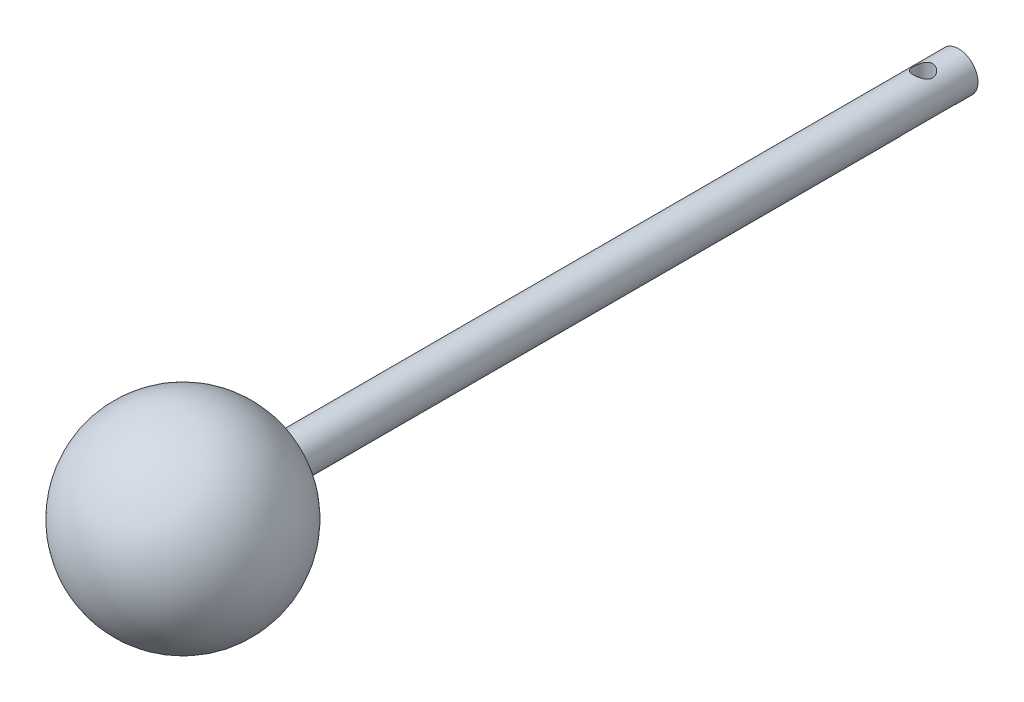
ISO-10303-21;
HEADER;
FILE_DESCRIPTION(('STEP AP214'),'2;1');
FILE_NAME('part.step','',(''),(''),'','','');
FILE_SCHEMA(('AUTOMOTIVE_DESIGN { 1 0 10303 214 1 1 1 1 }'));
ENDSEC;
DATA;
#1=APPLICATION_CONTEXT('core data for automotive mechanical design processes');
#2=APPLICATION_PROTOCOL_DEFINITION('international standard','automotive_design',2000,#1);
#3=PRODUCT_CONTEXT('',#1,'mechanical');
#4=PRODUCT('Part','Part','',(#3));
#5=PRODUCT_RELATED_PRODUCT_CATEGORY('part','',(#4));
#6=PRODUCT_DEFINITION_FORMATION('','',#4);
#7=PRODUCT_DEFINITION_CONTEXT('part definition',#1,'design');
#8=PRODUCT_DEFINITION('design','',#6,#7);
#9=PRODUCT_DEFINITION_SHAPE('','',#8);
#10=(LENGTH_UNIT() NAMED_UNIT(*) SI_UNIT(.MILLI.,.METRE.));
#11=(NAMED_UNIT(*) PLANE_ANGLE_UNIT() SI_UNIT($,.RADIAN.));
#12=(NAMED_UNIT(*) SI_UNIT($,.STERADIAN.) SOLID_ANGLE_UNIT());
#13=UNCERTAINTY_MEASURE_WITH_UNIT(LENGTH_MEASURE(1.E-05),#10,'distance_accuracy_value','');
#14=(GEOMETRIC_REPRESENTATION_CONTEXT(3) GLOBAL_UNCERTAINTY_ASSIGNED_CONTEXT((#13)) GLOBAL_UNIT_ASSIGNED_CONTEXT((#10,
#11,#12)) REPRESENTATION_CONTEXT('',''));
#15=CARTESIAN_POINT('',(0.,0.,0.));
#16=DIRECTION('',(0.,0.,1.));
#17=DIRECTION('',(1.,0.,0.));
#18=AXIS2_PLACEMENT_3D('',#15,#16,#17);
#19=CARTESIAN_POINT('',(0.,8.42264551000838,9.18353481621943));
#20=DIRECTION('',(0.,-1.,0.));
#21=DIRECTION('',(1.,0.,0.));
#22=AXIS2_PLACEMENT_3D('',#19,#20,#21);
#23=CYLINDRICAL_SURFACE('',#22,2.5);
#24=CARTESIAN_POINT('',(0.,-3.,9.18353481621943));
#25=DIRECTION('',(0.,1.,0.));
#26=DIRECTION('',(1.,0.,0.));
#27=AXIS2_PLACEMENT_3D('',#24,#25,#26);
#28=CIRCLE('',#27,2.5);
#29=CARTESIAN_POINT('',(2.5,-3.,9.18353481621943));
#30=VERTEX_POINT('',#29);
#31=EDGE_CURVE('E40',#30,#30,#28,.T.);
#32=ORIENTED_EDGE('',*,*,#31,.F.);
#33=EDGE_LOOP('',(#32));
#34=FACE_BOUND('',#33,.T.);
#35=CARTESIAN_POINT('',(2.49999999999999,4.3301270189222,9.18353481621945));
#36=CARTESIAN_POINT('',(2.50000357189181,4.33012436846133,9.2134385648796));
#37=CARTESIAN_POINT('',(2.49945420580769,4.33044211508466,9.24334183117544));
#38=CARTESIAN_POINT('',(2.49725839067198,4.33170907479288,9.3031838027478));
#39=CARTESIAN_POINT('',(2.49560868590302,4.33266016181208,9.33312234921477));
#40=CARTESIAN_POINT('',(2.49121069817965,4.33519034607211,9.3930345978749));
#41=CARTESIAN_POINT('',(2.48845724388733,4.33677239936563,9.4230077937966));
#42=CARTESIAN_POINT('',(2.48185027129498,4.34055686754822,9.48299031380353));
#43=CARTESIAN_POINT('',(2.4779897580484,4.34276322588981,9.51299861931255));
#44=CARTESIAN_POINT('',(2.47027696763565,4.34715380464842,9.56548838963977));
#45=CARTESIAN_POINT('',(2.46665390808778,4.34921128874467,9.58801455516167));
#46=CARTESIAN_POINT('',(2.45878399689496,4.35366533020504,9.63308717371318));
#47=CARTESIAN_POINT('',(2.45453296784057,4.35606415398197,9.65563267093891));
#48=CARTESIAN_POINT('',(2.44256078669089,4.36279379411801,9.71480480398581));
#49=CARTESIAN_POINT('',(2.43434738139976,4.36738580491933,9.75130355017033));
#50=CARTESIAN_POINT('',(2.41634324282664,4.37737265189183,9.82384315044416));
#51=CARTESIAN_POINT('',(2.40655071683352,4.38276839997567,9.85988343328606));
#52=CARTESIAN_POINT('',(2.38750031284656,4.39316918305496,9.92431797634327));
#53=CARTESIAN_POINT('',(2.37851907068697,4.39804078069178,9.95281601742791));
#54=CARTESIAN_POINT('',(2.35953101130036,4.40825704661183,10.0095215430486));
#55=CARTESIAN_POINT('',(2.34951999263467,4.41360363971139,10.0377272751838));
#56=CARTESIAN_POINT('',(2.32845922204102,4.42475087174056,10.0938462625237));
#57=CARTESIAN_POINT('',(2.3174038826815,4.43055392158107,10.1217569395754));
#58=CARTESIAN_POINT('',(2.29463041471399,4.44239033281668,10.1764072904831));
#59=CARTESIAN_POINT('',(2.28293576393672,4.44841431015372,10.2031587955206));
#60=CARTESIAN_POINT('',(2.25866751152916,4.4607854119482,10.256161842027));
#61=CARTESIAN_POINT('',(2.24609449643943,4.46713232000886,10.2824137025144));
#62=CARTESIAN_POINT('',(2.22005682930066,4.48012940275288,10.3344156930305));
#63=CARTESIAN_POINT('',(2.20659164698111,4.48677975704879,10.360165512683));
#64=CARTESIAN_POINT('',(2.17876180143769,4.50035967289574,10.4111646904905));
#65=CARTESIAN_POINT('',(2.16439551335376,4.50728973028826,10.4364130298194));
#66=CARTESIAN_POINT('',(2.1347539545745,4.52140418715307,10.4864098023569));
#67=CARTESIAN_POINT('',(2.11947600075465,4.52858930934856,10.5111564405466));
#68=CARTESIAN_POINT('',(2.08800175977412,4.54318730276697,10.5601506405346));
#69=CARTESIAN_POINT('',(2.07180178387543,4.55060102517722,10.5843955784495));
#70=CARTESIAN_POINT('',(2.03847389364994,4.5656281220451,10.6323872022057));
#71=CARTESIAN_POINT('',(2.02134134869948,4.57324237300109,10.6561303968736));
#72=CARTESIAN_POINT('',(1.98613864423402,4.58864084620464,10.7031193990812));
#73=CARTESIAN_POINT('',(1.96806298677012,4.59642586401521,10.7263608255402));
#74=CARTESIAN_POINT('',(1.93096439564478,4.6121345824022,10.7723472028923));
#75=CARTESIAN_POINT('',(1.91193517970728,4.62005889088795,10.7950868759854));
#76=CARTESIAN_POINT('',(1.87291975037994,4.63601334265663,10.8400705394552));
#77=CARTESIAN_POINT('',(1.852926558184,4.64404380193728,10.8623083623097));
#78=CARTESIAN_POINT('',(1.81197411084306,4.66017583924934,10.9062895692655));
#79=CARTESIAN_POINT('',(1.7910072778744,4.66827733837698,10.9280259224902));
#80=CARTESIAN_POINT('',(1.74866284531215,4.68430174657911,10.9704367821735));
#81=CARTESIAN_POINT('',(1.72729688996092,4.69222546065396,10.9911226114262));
#82=CARTESIAN_POINT('',(1.6839909011161,4.70794026302045,11.0316149636858));
#83=CARTESIAN_POINT('',(1.662055766514,4.71573188698127,11.0514265144381));
#84=CARTESIAN_POINT('',(1.61761006615234,4.73116136132125,11.0901711596232));
#85=CARTESIAN_POINT('',(1.59510359420044,4.73879984287848,11.1091086970126));
#86=CARTESIAN_POINT('',(1.54951378010458,4.75390164736191,11.146105835023));
#87=CARTESIAN_POINT('',(1.52643372473657,4.76136563496258,11.1641692127611));
#88=CARTESIAN_POINT('',(1.47969591264843,4.77609653334003,11.1994187433354));
#89=CARTESIAN_POINT('',(1.4560406427138,4.78336407741085,11.2166079276397));
#90=CARTESIAN_POINT('',(1.40815202014002,4.79767972765538,11.250109833688));
#91=CARTESIAN_POINT('',(1.38392037575836,4.80472836692863,11.2664247687466));
#92=CARTESIAN_POINT('',(1.33487913705574,4.81858339206425,11.2981790079978));
#93=CARTESIAN_POINT('',(1.31007050716133,4.82539013998691,11.313619643333));
#94=CARTESIAN_POINT('',(1.25987596593104,4.83873812517975,11.3436262058824));
#95=CARTESIAN_POINT('',(1.23449032279257,4.84527948202031,11.3581925284637));
#96=CARTESIAN_POINT('',(1.18314293650637,4.85807300172515,11.3864513188925));
#97=CARTESIAN_POINT('',(1.15718082481791,4.86432497121629,11.4001432046831));
#98=CARTESIAN_POINT('',(1.10468240089864,4.87651558545201,11.4266544601307));
#99=CARTESIAN_POINT('',(1.07814515357589,4.88245365595984,11.4394722423599));
#100=CARTESIAN_POINT('',(1.02449842284697,4.89399201700327,11.4642349785633));
#101=CARTESIAN_POINT('',(0.997387515280483,4.89959128882051,11.4761773209781));
#102=CARTESIAN_POINT('',(0.942031030932071,4.91053899476818,11.4994333717356));
#103=CARTESIAN_POINT('',(0.913773966657685,4.91587782038927,11.5107242744015));
#104=CARTESIAN_POINT('',(0.857034976824977,4.92608518197945,11.5322286087608));
#105=CARTESIAN_POINT('',(0.828556668433257,4.9309571441616,11.5424499506085));
#106=CARTESIAN_POINT('',(0.771382855792471,4.94022280350879,11.5618147223377));
#107=CARTESIAN_POINT('',(0.742690204027521,4.94461956738769,11.5709651000724));
#108=CARTESIAN_POINT('',(0.685096241422916,4.9529268909176,11.5881893065414));
#109=CARTESIAN_POINT('',(0.656197067647812,4.95684009166168,11.5962690023563));
#110=CARTESIAN_POINT('',(0.598198627219454,4.96417253096754,11.6113528662115));
#111=CARTESIAN_POINT('',(0.569100854438773,4.96759392132686,11.6183617284601));
#112=CARTESIAN_POINT('',(0.510714014108328,4.97393512902604,11.6313051443186));
#113=CARTESIAN_POINT('',(0.481425883889614,4.97685655075075,11.6372431377448));
#114=CARTESIAN_POINT('',(0.422667286881024,4.98219036861321,11.6480461243669));
#115=CARTESIAN_POINT('',(0.393197301642624,4.98460377066108,11.6529132388508));
#116=CARTESIAN_POINT('',(0.334084112865155,4.98891425181047,11.6615756764101));
#117=CARTESIAN_POINT('',(0.304441047039379,4.99081169598054,11.6653717573726));
#118=CARTESIAN_POINT('',(0.244990971840921,4.9940831185346,11.6718939928751));
#119=CARTESIAN_POINT('',(0.215183876389995,4.99545678875643,11.6746195175821));
#120=CARTESIAN_POINT('',(0.155415128343623,4.99767367075587,11.679000208854));
#121=CARTESIAN_POINT('',(0.125453290470905,4.99851587965877,11.6806533519838));
#122=CARTESIAN_POINT('',(0.0653846981960944,4.99966299807511,11.6828975027709));
#123=CARTESIAN_POINT('',(0.0352777851564572,4.99996619995026,11.6834851348798));
#124=CARTESIAN_POINT('',(-0.0248862169766115,5.00002840095424,11.6835737304757));
#125=CARTESIAN_POINT('',(-0.054943301803073,4.99978834418574,11.6830765792086));
#126=CARTESIAN_POINT('',(-0.115065322202673,4.99876640491978,11.6809765250161));
#127=CARTESIAN_POINT('',(-0.145130169533901,4.99798352141381,11.6793715792691));
#128=CARTESIAN_POINT('',(-0.205257893763868,4.99587600403502,11.6750642827602));
#129=CARTESIAN_POINT('',(-0.235320460898459,4.99454965678501,11.672358461462));
#130=CARTESIAN_POINT('',(-0.295434640940632,4.99135536176211,11.6658488750451));
#131=CARTESIAN_POINT('',(-0.325485600816148,4.9894850131257,11.662040243188));
#132=CARTESIAN_POINT('',(-0.378015766857459,4.98574132129471,11.6544221833287));
#133=CARTESIAN_POINT('',(-0.400537094940378,4.98398215220402,11.6508439448819));
#134=CARTESIAN_POINT('',(-0.445564531260932,4.98015915801641,11.6430705470995));
#135=CARTESIAN_POINT('',(-0.46806999877624,4.97809385172167,11.6388723887753));
#136=CARTESIAN_POINT('',(-0.505321729887863,4.97442175696046,11.6314100873184));
#137=CARTESIAN_POINT('',(-0.520109857551539,4.97289714859784,11.6283123190343));
#138=CARTESIAN_POINT('',(-0.564327611330325,4.96813972036703,11.618641168258));
#139=CARTESIAN_POINT('',(-0.593654090325438,4.96471939473746,11.6116820243195));
#140=CARTESIAN_POINT('',(-0.651957357598609,4.95739994143524,11.5967453132958));
#141=CARTESIAN_POINT('',(-0.680934429945751,4.95350123621516,11.5887686445343));
#142=CARTESIAN_POINT('',(-0.738533375828231,4.94524167126844,11.5717975987022));
#143=CARTESIAN_POINT('',(-0.767155126194414,4.94088065602236,11.5628028790937));
#144=CARTESIAN_POINT('',(-0.824037642168308,4.93171300399732,11.5437982792166));
#145=CARTESIAN_POINT('',(-0.852297779135632,4.9269056866458,11.53378684629));
#146=CARTESIAN_POINT('',(-0.908449952238239,4.91686226232377,11.5127453319664));
#147=CARTESIAN_POINT('',(-0.936340760122503,4.91162501080349,11.5017125208456));
#148=CARTESIAN_POINT('',(-0.991422632559728,4.90080222994119,11.4787858647256));
#149=CARTESIAN_POINT('',(-1.0186175425954,4.89521987837902,11.4668997494426));
#150=CARTESIAN_POINT('',(-1.0724385782207,4.88371075360811,11.4422425874943));
#151=CARTESIAN_POINT('',(-1.09906602087871,4.87778493299342,11.4294739710773));
#152=CARTESIAN_POINT('',(-1.1517486315468,4.86561454573107,11.4030482451876));
#153=CARTESIAN_POINT('',(-1.17780461783901,4.85937048409452,11.3893925345202));
#154=CARTESIAN_POINT('',(-1.22934407503335,4.84658826146615,11.3611948992809));
#155=CARTESIAN_POINT('',(-1.25482778021704,4.84005022423945,11.3466533467545));
#156=CARTESIAN_POINT('',(-1.30522248712119,4.8267042791642,11.3166847241174));
#157=CARTESIAN_POINT('',(-1.33013306932871,4.81989618298314,11.3012570325524));
#158=CARTESIAN_POINT('',(-1.37938219128708,4.80603374896337,11.2695172085934));
#159=CARTESIAN_POINT('',(-1.40371959827919,4.79897898246865,11.2532035062205));
#160=CARTESIAN_POINT('',(-1.45182360825639,4.78464627111744,11.2196925767869));
#161=CARTESIAN_POINT('',(-1.47558831814384,4.77736772993233,11.2024928881315));
#162=CARTESIAN_POINT('',(-1.52254876412806,4.76260994540286,11.1672108683558));
#163=CARTESIAN_POINT('',(-1.54574181316511,4.75513000992087,11.1491252515708));
#164=CARTESIAN_POINT('',(-1.59156129209266,4.73999132901436,11.1120721878689));
#165=CARTESIAN_POINT('',(-1.61418422114388,4.73233186521383,11.0931007072301));
#166=CARTESIAN_POINT('',(-1.65886631166173,4.7168554136314,11.0542766156075));
#167=CARTESIAN_POINT('',(-1.68092115265911,4.70903774695441,11.0344193050344));
#168=CARTESIAN_POINT('',(-1.72447031191378,4.69326564112242,10.9938243015744));
#169=CARTESIAN_POINT('',(-1.74595949726196,4.6853106237693,10.973081330694));
#170=CARTESIAN_POINT('',(-1.78842621393352,4.66926674205247,10.9306701589135));
#171=CARTESIAN_POINT('',(-1.80939625423543,4.66117734118994,10.908994659568));
#172=CARTESIAN_POINT('',(-1.85035948560423,4.64506722731085,10.8651326415768));
#173=CARTESIAN_POINT('',(-1.87036015154586,4.63704660492418,10.8429530744696));
#174=CARTESIAN_POINT('',(-1.9093951943011,4.62110923515827,10.7980838503633));
#175=CARTESIAN_POINT('',(-1.92843644354412,4.61319218997795,10.7754002803578));
#176=CARTESIAN_POINT('',(-1.96556357757294,4.59749529028218,10.7295239150944));
#177=CARTESIAN_POINT('',(-1.98365564034865,4.58971484997981,10.706336322038));
#178=CARTESIAN_POINT('',(-2.01889557439279,4.57432267662596,10.6594528196424));
#179=CARTESIAN_POINT('',(-2.0360488414329,4.56671017352353,10.6357612202542));
#180=CARTESIAN_POINT('',(-2.06942250695841,4.55168360044342,10.5878706065284));
#181=CARTESIAN_POINT('',(-2.08564743741214,4.54426868173667,10.5636750176363));
#182=CARTESIAN_POINT('',(-2.11717584591211,4.52966522007198,10.5147773323855));
#183=CARTESIAN_POINT('',(-2.13248291871317,4.52247585486568,10.490077799995));
#184=CARTESIAN_POINT('',(-2.16218689889235,4.50834975301974,10.4401730464351));
#185=CARTESIAN_POINT('',(-2.17658640131949,4.50141232260569,10.4149695664791));
#186=CARTESIAN_POINT('',(-2.20448681010782,4.4878144248331,10.364057918314));
#187=CARTESIAN_POINT('',(-2.21798926032284,4.48115348944551,10.3383507212779));
#188=CARTESIAN_POINT('',(-2.2441054828023,4.4681319850139,10.2864317442777));
#189=CARTESIAN_POINT('',(-2.25671971245245,4.46177126194144,10.2602202329946));
#190=CARTESIAN_POINT('',(-2.28107457695479,4.44936912451037,10.207295782471));
#191=CARTESIAN_POINT('',(-2.29281456191901,4.44332794864139,10.180582488332));
#192=CARTESIAN_POINT('',(-2.31565961584536,4.43146589910227,10.126062986068));
#193=CARTESIAN_POINT('',(-2.32674313487943,4.42565360082379,10.0982458672655));
#194=CARTESIAN_POINT('',(-2.34786513228278,4.41448426867569,10.0423149783967));
#195=CARTESIAN_POINT('',(-2.35790921233472,4.40912482650033,10.0142038063986));
#196=CARTESIAN_POINT('',(-2.37696849125148,4.39887909802672,9.95768792679288));
#197=CARTESIAN_POINT('',(-2.38598792215553,4.39399087917006,9.92928499751093));
#198=CARTESIAN_POINT('',(-2.40300762345494,4.38470615767644,9.87218612467783));
#199=CARTESIAN_POINT('',(-2.41101071702147,4.38030829727169,9.84349124307917));
#200=CARTESIAN_POINT('',(-2.42600820429211,4.37201984756252,9.7858080966517));
#201=CARTESIAN_POINT('',(-2.43300395769211,4.36812857516541,9.75682028490194));
#202=CARTESIAN_POINT('',(-2.44274698536783,4.36268276862039,9.71312587997515));
#203=CARTESIAN_POINT('',(-2.44586950270997,4.36093271634866,9.69852594170867));
#204=CARTESIAN_POINT('',(-2.45345387843561,4.35667210219709,9.66149592705286));
#205=CARTESIAN_POINT('',(-2.45774752412372,4.35425058666724,9.63902068026902));
#206=CARTESIAN_POINT('',(-2.46570499822654,4.34974937090871,9.59408483262976));
#207=CARTESIAN_POINT('',(-2.46937291666076,4.34766745517157,9.57162517439396));
#208=CARTESIAN_POINT('',(-2.47719352400692,4.34321754458178,9.51928387531861));
#209=CARTESIAN_POINT('',(-2.48111779571376,4.34097565816996,9.48935689407158));
#210=CARTESIAN_POINT('',(-2.48785696062326,4.33711686678043,9.42952899668036));
#211=CARTESIAN_POINT('',(-2.49067864925463,4.33549613473843,9.39962909161609));
#212=CARTESIAN_POINT('',(-2.49521792526165,4.3328852221355,9.33985537925674));
#213=CARTESIAN_POINT('',(-2.49694049494245,4.33189219637665,9.30998207611879));
#214=CARTESIAN_POINT('',(-2.49928675032716,4.3305389469932,9.25026221307012));
#215=CARTESIAN_POINT('',(-2.49991351768171,4.33017694878109,9.22041581485234));
#216=CARTESIAN_POINT('',(-2.50006672218875,4.3300884975495,9.16071007942312));
#217=CARTESIAN_POINT('',(-2.49959282373387,4.33036223837514,9.13085074104152));
#218=CARTESIAN_POINT('',(-2.49754564368272,4.33154327585312,9.0710683966838));
#219=CARTESIAN_POINT('',(-2.49596817491021,4.33245298549465,9.04114558238437));
#220=CARTESIAN_POINT('',(-2.49171491230013,4.33490055647972,8.98123614506266));
#221=CARTESIAN_POINT('',(-2.48903303761676,4.33644189533302,8.95125009800356));
#222=CARTESIAN_POINT('',(-2.4825689366641,4.34014578704983,8.89121328104734));
#223=CARTESIAN_POINT('',(-2.47877882939259,4.34231278775903,8.86116363359196));
#224=CARTESIAN_POINT('',(-2.47118964508965,4.34663499783012,8.80858183324445));
#225=CARTESIAN_POINT('',(-2.46761879016612,4.34866385273424,8.7860059311507));
#226=CARTESIAN_POINT('',(-2.45985349054963,4.35306108680075,8.74081763506724));
#227=CARTESIAN_POINT('',(-2.45565452969892,4.35543192001268,8.71820625865663));
#228=CARTESIAN_POINT('',(-2.44381069383092,4.36209361889763,8.658810316123));
#229=CARTESIAN_POINT('',(-2.43567195497703,4.36664705199428,8.62215222809874));
#230=CARTESIAN_POINT('',(-2.41781410083878,4.37656020312242,8.549315180928));
#231=CARTESIAN_POINT('',(-2.40809423699485,4.38192030296758,8.51313645754626));
#232=CARTESIAN_POINT('',(-2.38917146372008,4.3922604274155,8.44846757410989));
#233=CARTESIAN_POINT('',(-2.3802474298191,4.39710547806521,8.4198737777915));
#234=CARTESIAN_POINT('',(-2.36137251185484,4.40727072532101,8.36299024705121));
#235=CARTESIAN_POINT('',(-2.35141791221731,4.41259263119342,8.33470204976886));
#236=CARTESIAN_POINT('',(-2.33046871539623,4.42369265214561,8.2784316708885));
#237=CARTESIAN_POINT('',(-2.31946898698191,4.42947299236244,8.25045184062628));
#238=CARTESIAN_POINT('',(-2.29679060386848,4.44127373413371,8.19564607905497));
#239=CARTESIAN_POINT('',(-2.28513493894109,4.4472848904099,8.1688086292402));
#240=CARTESIAN_POINT('',(-2.26093578319198,4.45963606968429,8.1156312756582));
#241=CARTESIAN_POINT('',(-2.2483927508084,4.46597592242316,8.08929112375648));
#242=CARTESIAN_POINT('',(-2.22240599471538,4.47896446737574,8.03711014734927));
#243=CARTESIAN_POINT('',(-2.20896159113653,4.48561339152411,8.01126971913077));
#244=CARTESIAN_POINT('',(-2.18116416300349,4.49919578084129,7.96008689873543));
#245=CARTESIAN_POINT('',(-2.16680934544627,4.50612979740651,7.93474562681556));
#246=CARTESIAN_POINT('',(-2.13718145763323,4.52025725222446,7.88456055002875));
#247=CARTESIAN_POINT('',(-2.12190551975674,4.5274514694254,7.8597186576951));
#248=CARTESIAN_POINT('',(-2.09042590473813,4.54207244179535,7.81053149415226));
#249=CARTESIAN_POINT('',(-2.07421834077472,4.54950010222879,7.78618898025588));
#250=CARTESIAN_POINT('',(-2.04086571955712,4.56455954137177,7.7379997327869));
#251=CARTESIAN_POINT('',(-2.02371582278045,4.57219224578005,7.71415663909284));
#252=CARTESIAN_POINT('',(-1.9884686969377,4.58763173707879,7.66696535597319));
#253=CARTESIAN_POINT('',(-1.97036575299414,4.59543936124109,7.64362171052014));
#254=CARTESIAN_POINT('',(-1.93320271593591,4.61119700792288,7.59742838439775));
#255=CARTESIAN_POINT('',(-1.91413611844193,4.6191476700919,7.57458415694765));
#256=CARTESIAN_POINT('',(-1.87503583136846,4.63515813699232,7.52938891601023));
#257=CARTESIAN_POINT('',(-1.85499493772917,4.64321827752721,7.50704425678044));
#258=CARTESIAN_POINT('',(-1.81393699677841,4.65941245295328,7.46284669355457));
#259=CARTESIAN_POINT('',(-1.79291214792821,4.66754641401748,7.44100101383588));
#260=CARTESIAN_POINT('',(-1.75048893209346,4.68361976679944,7.39841919746458));
#261=CARTESIAN_POINT('',(-1.72910373978136,4.69156005606397,7.37767027300535));
#262=CARTESIAN_POINT('',(-1.68575768559864,4.70730803920402,7.33705580934387));
#263=CARTESIAN_POINT('',(-1.66380179666083,4.7151162694889,7.31718517454015));
#264=CARTESIAN_POINT('',(-1.61931316607485,4.73057884313765,7.27832623760695));
#265=CARTESIAN_POINT('',(-1.59678458499078,4.73823382210092,7.25933342695662));
#266=CARTESIAN_POINT('',(-1.55114907347632,4.75336845021878,7.22222967117241));
#267=CARTESIAN_POINT('',(-1.52804549015915,4.76084877120249,7.20411488508604));
#268=CARTESIAN_POINT('',(-1.48125914889766,4.77561208166241,7.16876645001231));
#269=CARTESIAN_POINT('',(-1.45757893081192,4.78289571398313,7.15152970898483));
#270=CARTESIAN_POINT('',(-1.40963893109848,4.79724320657007,7.11793660167055));
#271=CARTESIAN_POINT('',(-1.38538090327769,4.80430761128797,7.10157796584806));
#272=CARTESIAN_POINT('',(-1.33628541569932,4.81819375010001,7.06974023247559));
#273=CARTESIAN_POINT('',(-1.31144895823793,4.82501585876526,7.0542597530634));
#274=CARTESIAN_POINT('',(-1.26119728213811,4.83839406331016,7.02417740068081));
#275=CARTESIAN_POINT('',(-1.23578236194533,4.84495029171665,7.00957508819453));
#276=CARTESIAN_POINT('',(-1.18437493979856,4.85777296699044,6.9812482224545));
#277=CARTESIAN_POINT('',(-1.15838209219058,4.86403923313305,6.96752421463379));
#278=CARTESIAN_POINT('',(-1.10582074218491,4.87625776064504,6.94095256286125));
#279=CARTESIAN_POINT('',(-1.07925132070103,4.88220945934245,6.92810647799086));
#280=CARTESIAN_POINT('',(-1.02553871682296,4.89377432254222,6.90329115893486));
#281=CARTESIAN_POINT('',(-0.998394119800228,4.89938647809135,6.89132451737201));
#282=CARTESIAN_POINT('',(-0.943004488143033,4.91035214605416,6.86803792729273));
#283=CARTESIAN_POINT('',(-0.914748557535929,4.91569656114496,6.85673959921702));
#284=CARTESIAN_POINT('',(-0.858008869673327,4.92591566233082,6.83521921431823));
#285=CARTESIAN_POINT('',(-0.829528688824369,4.93079373323077,6.82498934262626));
#286=CARTESIAN_POINT('',(-0.772348064977339,4.94007202945738,6.80560649784171));
#287=CARTESIAN_POINT('',(-0.743650436941315,4.94447527874523,6.79644667447302));
#288=CARTESIAN_POINT('',(-0.686043451488618,4.95279583063504,6.77920250963247));
#289=CARTESIAN_POINT('',(-0.657136196833357,4.9567157304441,6.77111240153763));
#290=CARTESIAN_POINT('',(-0.599118500665963,4.96406166610843,6.75600665711298));
#291=CARTESIAN_POINT('',(-0.570009522575816,4.9674898088546,6.74898642837448));
#292=CARTESIAN_POINT('',(-0.511597165527898,4.97384445677921,6.73601921942044));
#293=CARTESIAN_POINT('',(-0.482294697632271,4.97677252060861,6.73006890131693));
#294=CARTESIAN_POINT('',(-0.423504310748636,4.98211939363687,6.71924020500136));
#295=CARTESIAN_POINT('',(-0.394016851424478,4.98453916240707,6.71435980619592));
#296=CARTESIAN_POINT('',(-0.334865597471637,4.98886198143733,6.7056697468737));
#297=CARTESIAN_POINT('',(-0.305201923064375,4.99076535006719,6.70185942658349));
#298=CARTESIAN_POINT('',(-0.245707517869068,4.99404805771825,6.69530764100304));
#299=CARTESIAN_POINT('',(-0.215876687740768,4.9954270417678,6.69256689971009));
#300=CARTESIAN_POINT('',(-0.156057365177914,4.99765381769267,6.68815478862535));
#301=CARTESIAN_POINT('',(-0.126068678087209,4.99850056000898,6.68648553162051));
#302=CARTESIAN_POINT('',(-0.0659433072374997,4.999655840401,6.6842078701169));
#303=CARTESIAN_POINT('',(-0.035806458891169,4.99996262448644,6.68360292290483));
#304=CARTESIAN_POINT('',(0.0243836053600901,5.00003085181549,6.6834797378089));
#305=CARTESIAN_POINT('',(0.0544368121873432,4.99979386292711,6.68395837555666));
#306=CARTESIAN_POINT('',(0.114540876981693,4.99877836227408,6.68602078566939));
#307=CARTESIAN_POINT('',(0.144591665251603,4.99799904725414,6.68760619732097));
#308=CARTESIAN_POINT('',(0.204681103079329,4.9958995183993,6.69187352154715));
#309=CARTESIAN_POINT('',(0.234719480608869,4.99457778891296,6.69455850658038));
#310=CARTESIAN_POINT('',(0.294775034196645,4.99139415045148,6.70102555564071));
#311=CARTESIAN_POINT('',(0.324791612441665,4.98953003723083,6.70481209637575));
#312=CARTESIAN_POINT('',(0.377255401821749,4.98579875931581,6.71239118518272));
#313=CARTESIAN_POINT('',(0.399744556045231,4.98404561848665,6.71595216566137));
#314=CARTESIAN_POINT('',(0.444701187676301,4.98023616184639,6.72369025187559));
#315=CARTESIAN_POINT('',(0.467168055441746,4.97817844640369,6.727870202044));
#316=CARTESIAN_POINT('',(0.526558743678327,4.97233520728819,6.73974088616114));
#317=CARTESIAN_POINT('',(0.563356976820832,4.96829794497945,6.74794363757572));
#318=CARTESIAN_POINT('',(0.636419195439916,4.95946802417064,6.76594874572634));
#319=CARTESIAN_POINT('',(0.672683779513571,4.95467629599351,6.77574913295584));
#320=CARTESIAN_POINT('',(0.737459501146081,4.94540190708359,6.79482428718166));
#321=CARTESIAN_POINT('',(0.766073636718462,4.94104841272942,6.80381361818142));
#322=CARTESIAN_POINT('',(0.822947081914783,4.9318950773332,6.82281143531107));
#323=CARTESIAN_POINT('',(0.851205675276045,4.92709446124271,6.83282169409871));
#324=CARTESIAN_POINT('',(0.907360083508226,4.91706352611358,6.85386534171293));
#325=CARTESIAN_POINT('',(0.935254569037395,4.91183197122016,6.86490168569903));
#326=CARTESIAN_POINT('',(0.990399829600447,4.90100936894227,6.88785830177563));
#327=CARTESIAN_POINT('',(1.01765349581986,4.89542071262674,6.89977276282428));
#328=CARTESIAN_POINT('',(1.07159191496202,4.88389693325529,6.92448804037172));
#329=CARTESIAN_POINT('',(1.09827797007997,4.87796275517868,6.93728645567763));
#330=CARTESIAN_POINT('',(1.15107739825019,4.86577371644594,6.9637738206039));
#331=CARTESIAN_POINT('',(1.17719157337726,4.85951935229336,6.97746139978707));
#332=CARTESIAN_POINT('',(1.22884703096305,4.84671463594998,7.00572464795598));
#333=CARTESIAN_POINT('',(1.25438852968333,4.84016439840692,7.02029997369949));
#334=CARTESIAN_POINT('',(1.30489839862393,4.82679222811232,7.0503380623883));
#335=CARTESIAN_POINT('',(1.32986632970395,4.81997009744782,7.06580147552767));
#336=CARTESIAN_POINT('',(1.37922970068666,4.80607782994478,7.09761465150554));
#337=CARTESIAN_POINT('',(1.40362398678991,4.79900725455129,7.11396601267881));
#338=CARTESIAN_POINT('',(1.45184128332601,4.78464122068282,7.14755416901289));
#339=CARTESIAN_POINT('',(1.47566237842891,4.77734515579026,7.16479345348819));
#340=CARTESIAN_POINT('',(1.52273509169381,4.76255068333396,7.20015658618255));
#341=CARTESIAN_POINT('',(1.54598399957319,4.75505157348422,7.21828374697837));
#342=CARTESIAN_POINT('',(1.59191471308332,4.73987294884107,7.25542177575577));
#343=CARTESIAN_POINT('',(1.61459299414522,4.73219270547497,7.27443670313078));
#344=CARTESIAN_POINT('',(1.6593851439285,4.71667321445332,7.31334973703729));
#345=CARTESIAN_POINT('',(1.68149466714114,4.70883327813894,7.33325256871276));
#346=CARTESIAN_POINT('',(1.72515308207843,4.69301500510932,7.3739400213179));
#347=CARTESIAN_POINT('',(1.74669681948543,4.68503607916602,7.39472994010992));
#348=CARTESIAN_POINT('',(1.78927565132777,4.66894161682482,7.43724402647236));
#349=CARTESIAN_POINT('',(1.81030303296368,4.66082552559241,7.45897570993553));
#350=CARTESIAN_POINT('',(1.85137118421677,4.64466435793864,7.50295242281513));
#351=CARTESIAN_POINT('',(1.87141960194398,4.63661936485488,7.52519033632161));
#352=CARTESIAN_POINT('',(1.91054111585729,4.62063579875266,7.57017791785721));
#353=CARTESIAN_POINT('',(1.92962124534626,4.61269691241291,7.59292135595556));
#354=CARTESIAN_POINT('',(1.96681711301094,4.59695933219472,7.63891927686063));
#355=CARTESIAN_POINT('',(1.98493918181067,4.58916002858775,7.66216842969528));
#356=CARTESIAN_POINT('',(2.02023029908177,4.57373347977698,7.70917680870834));
#357=CARTESIAN_POINT('',(2.03740488344006,4.56610543531782,7.73293161510288));
#358=CARTESIAN_POINT('',(2.0708125017162,4.55105146397255,7.78095039321642));
#359=CARTESIAN_POINT('',(2.08705019292226,4.54362465645643,7.80521084769156));
#360=CARTESIAN_POINT('',(2.11859559505692,4.52900139731288,7.85423999423488));
#361=CARTESIAN_POINT('',(2.13390700869464,4.52180409162822,7.87900604865024));
#362=CARTESIAN_POINT('',(2.16361130050652,4.50766634602744,7.92904555307272));
#363=CARTESIAN_POINT('',(2.17800686203489,4.50072518336628,7.95431720574892));
#364=CARTESIAN_POINT('',(2.20589112565542,4.48712430548934,8.00536690935667));
#365=CARTESIAN_POINT('',(2.21938143839656,4.48046409867818,8.03114394943409));
#366=CARTESIAN_POINT('',(2.24546539004661,4.46744866344388,8.08320422723539));
#367=CARTESIAN_POINT('',(2.2580595299884,4.46109326526649,8.10948717150709));
#368=CARTESIAN_POINT('',(2.28236584497707,4.44870681186252,8.16255638213424));
#369=CARTESIAN_POINT('',(2.29407738928394,4.44267598945496,8.18934299166488));
#370=CARTESIAN_POINT('',(2.31687365085219,4.43083124288873,8.24404789974908));
#371=CARTESIAN_POINT('',(2.32793542755631,4.42502648914233,8.27197775739015));
#372=CARTESIAN_POINT('',(2.34901324736583,4.41387339119965,8.32814715437525));
#373=CARTESIAN_POINT('',(2.35903445549263,4.40852281943632,8.35638431115252));
#374=CARTESIAN_POINT('',(2.37804672429512,4.39829623730661,8.41316491085697));
#375=CARTESIAN_POINT('',(2.38704155755468,4.39341849962761,8.44170678066146));
#376=CARTESIAN_POINT('',(2.40612804649964,4.38300052682814,8.50625709355439));
#377=CARTESIAN_POINT('',(2.41594239805154,4.3775939554373,8.54236955222144));
#378=CARTESIAN_POINT('',(2.43399601667908,4.36758170736321,8.61507262764545));
#379=CARTESIAN_POINT('',(2.44223623596866,4.36297554665407,8.6516629409371));
#380=CARTESIAN_POINT('',(2.45425899254668,4.35621855000214,8.7110036311969));
#381=CARTESIAN_POINT('',(2.4585320535655,4.35380763497924,8.73362642755314));
#382=CARTESIAN_POINT('',(2.46644309175201,4.34933086895668,8.77883661019778));
#383=CARTESIAN_POINT('',(2.47008568832374,4.34726251331491,8.80142293737657));
#384=CARTESIAN_POINT('',(2.47783928903757,4.34284910913974,8.85402650118179));
#385=CARTESIAN_POINT('',(2.48172180382559,4.34063034142149,8.8840884373641));
#386=CARTESIAN_POINT('',(2.4883669176082,4.33682424523065,8.94414805036723));
#387=CARTESIAN_POINT('',(2.49113764137643,4.33523233743489,8.97414453853078));
#388=CARTESIAN_POINT('',(2.4955642775039,4.33268574985482,9.03407318804825));
#389=CARTESIAN_POINT('',(2.49722651437861,4.3317274552374,9.06400472597784));
#390=CARTESIAN_POINT('',(2.49944150702773,4.33044944752996,9.12380232979519));
#391=CARTESIAN_POINT('',(2.49999867479784,4.33012719506258,9.15366817856063));
#392=CARTESIAN_POINT('',(2.49999999999999,4.3301270189222,9.18353481621945));
#393=B_SPLINE_CURVE_WITH_KNOTS('',3,(#35,#36,#37,#38,#39,#40,#41,#42,#43,#44,#45,#46,#47,#48,
#49,#50,#51,#52,#53,#54,#55,#56,#57,#58,#59,#60,#61,#62,#63,#64,#65,#66,#67,#68,#69,#70,#71,#72,
#73,#74,#75,#76,#77,#78,#79,#80,#81,#82,#83,#84,#85,#86,#87,#88,#89,#90,#91,#92,#93,#94,#95,#96,
#97,#98,#99,#100,#101,#102,#103,#104,#105,#106,#107,#108,#109,#110,#111,#112,#113,#114,#115,
#116,#117,#118,#119,#120,#121,#122,#123,#124,#125,#126,#127,#128,#129,#130,#131,#132,#133,#134,
#135,#136,#137,#138,#139,#140,#141,#142,#143,#144,#145,#146,#147,#148,#149,#150,#151,#152,#153,
#154,#155,#156,#157,#158,#159,#160,#161,#162,#163,#164,#165,#166,#167,#168,#169,#170,#171,#172,
#173,#174,#175,#176,#177,#178,#179,#180,#181,#182,#183,#184,#185,#186,#187,#188,#189,#190,#191,
#192,#193,#194,#195,#196,#197,#198,#199,#200,#201,#202,#203,#204,#205,#206,#207,#208,#209,#210,
#211,#212,#213,#214,#215,#216,#217,#218,#219,#220,#221,#222,#223,#224,#225,#226,#227,#228,#229,
#230,#231,#232,#233,#234,#235,#236,#237,#238,#239,#240,#241,#242,#243,#244,#245,#246,#247,#248,
#249,#250,#251,#252,#253,#254,#255,#256,#257,#258,#259,#260,#261,#262,#263,#264,#265,#266,#267,
#268,#269,#270,#271,#272,#273,#274,#275,#276,#277,#278,#279,#280,#281,#282,#283,#284,#285,#286,
#287,#288,#289,#290,#291,#292,#293,#294,#295,#296,#297,#298,#299,#300,#301,#302,#303,#304,#305,
#306,#307,#308,#309,#310,#311,#312,#313,#314,#315,#316,#317,#318,#319,#320,#321,#322,#323,#324,
#325,#326,#327,#328,#329,#330,#331,#332,#333,#334,#335,#336,#337,#338,#339,#340,#341,#342,#343,
#344,#345,#346,#347,#348,#349,#350,#351,#352,#353,#354,#355,#356,#357,#358,#359,#360,#361,#362,
#363,#364,#365,#366,#367,#368,#369,#370,#371,#372,#373,#374,#375,#376,#377,#378,#379,#380,#381,
#382,#383,#384,#385,#386,#387,#388,#389,#390,#391,#392),.UNSPECIFIED.,.F.,.F.,(4,2,2,2,2,2,2,2,
2,2,2,2,2,2,2,2,2,2,2,2,2,2,2,2,2,2,2,2,2,2,2,2,2,2,2,2,2,2,2,2,2,2,2,2,2,2,2,2,2,2,2,2,2,2,2,2,
2,2,2,2,2,2,2,2,2,2,2,2,2,2,2,2,2,2,2,2,2,2,2,2,2,2,2,2,2,2,2,2,2,2,2,2,2,2,2,2,2,2,2,2,2,2,2,2,
2,2,2,2,2,2,2,2,2,2,2,2,2,2,2,2,2,2,2,2,2,2,2,2,2,2,2,2,2,2,2,2,2,2,2,2,2,2,2,2,2,2,2,2,2,2,2,2,
2,2,2,2,2,2,2,2,2,2,2,2,2,2,2,2,2,2,2,2,2,2,2,2,2,2,4),(0.,0.0897036407882287,0.179673884013625,
0.270070681087394,0.361051733524215,0.429766200339865,0.498960277053857,0.611990144995458,
0.72514924637176,0.815950631651252,0.907138398099782,0.998845137028114,1.08825931971475,
1.17761435519927,1.2670229848078,1.35659774707546,1.4464505558559,1.53669229006829,
1.62743240241173,1.71877855357962,1.81083627747151,1.90370868170098,1.99749618641382,
2.08980885190265,2.18149302291117,2.27264339310788,2.36335632775487,2.45372959134064,
2.5438620535563,2.63385337766638,2.72380369596446,2.81381327748721,2.90398219345595,
2.99440998600192,3.08707078928316,3.1789889622628,3.27027320411669,3.36103449170691,
3.45138572892057,3.54144136191144,3.63131696609084,3.7211288118866,3.81099341720377,
3.90102709510733,3.99134550546124,4.08150707641728,4.17183535502635,4.26245062983052,
4.35347205154721,4.42207742855105,4.49102628582235,4.53658168281604,4.6275594590582,
4.71845746420971,4.80938614474218,4.90045583554512,4.99177636042086,5.08235442518871,
5.1726922947089,5.26289102017278,5.35305212073499,5.44327724266246,5.53366781634813,
5.62432471694932,5.71534793427038,5.80683625715335,5.89888697709492,5.99159561510865,
6.08525343175437,6.1780072765773,6.26995722542466,6.36120599976409,6.45185870523783,
6.5420225326081,6.63180642415856,6.72132070987343,6.81067671888367,6.8999863726711,
6.98936176728577,7.08084846589205,7.1718131869452,7.26238738070466,7.3527042031607,
7.44289795070453,7.48799291563954,7.55700989763823,7.62555686355033,7.71632895957434,
7.80653243683022,7.8963240612034,7.98586276203392,8.07542876796576,8.16533646222563,
8.25574595028917,8.34681469092109,8.41564376945425,8.48499390957336,8.59842417539471,
8.71190830018338,8.80291661038603,8.89426528981648,8.98608824264561,9.07568015247021,
9.16522611000389,9.25484038542327,9.34463698765374,9.43472923297082,9.52522932662982,
9.61624796502878,9.70789396504036,9.80027392603974,9.89349192888708,9.9876492747783,
10.0801420137046,10.1719983950381,10.263313609729,10.3541845493261,10.44470953185,
10.5349880055212,10.6251202344216,10.7152069708255,10.8053491194391,10.8956473990938,
10.9862020075416,11.0788707412741,11.1708055898581,11.2621152427567,11.3529106346878,
11.4433045937453,11.5334114560059,11.6233466525228,11.713226275752,11.803166633344,
11.8932837977909,11.9836931606013,12.0738421725591,12.164124991864,12.2546618221362,
12.345571859422,12.4140721817509,12.4828976668069,12.5966009164654,12.7101650424537,
12.8010650956009,12.8921257579031,12.983457320449,13.0742310057156,13.1647671360348,
13.2551668930944,13.3455319167849,13.4359639642197,13.5265645667874,13.6174346909903,
13.7086744086729,13.8003825818869,13.8926565670876,13.9855919426555,14.0795028351523,
14.1724936000017,14.2646655944762,14.3561228987018,14.4469720497553,14.5373217366421,
14.6272824592595,14.7169661557683,14.8064858040302,14.8959550038292,14.9854875474107,
15.0772547230162,15.1685421135365,15.2594823507494,15.3728699693327,15.4861887794951,
15.5556255149761,15.624529708443,15.7156810534392,15.8061535878047,15.8961054074315,
15.9856973650387),.UNSPECIFIED.);
#394=CARTESIAN_POINT('',(2.5,4.33012701892221,9.18353481621943));
#395=VERTEX_POINT('',#394);
#396=EDGE_CURVE('E108',#395,#395,#393,.T.);
#397=ORIENTED_EDGE('',*,*,#396,.F.);
#398=EDGE_LOOP('',(#397));
#399=FACE_BOUND('',#398,.T.);
#400=ADVANCED_FACE('F16',(#34,#399),#23,.F.);
#401=CARTESIAN_POINT('',(-4.74113189811159,-3.,3.96323828942932));
#402=DIRECTION('',(0.,0.,-1.));
#403=DIRECTION('',(0.,-1.,0.));
#404=AXIS2_PLACEMENT_3D('',#401,#402,#403);
#405=PLANE('',#404);
#406=DIRECTION('',(1.,0.,0.));
#407=VECTOR('',#406,1.);
#408=CARTESIAN_POINT('',(-4.74113189811159,-3.,3.96323828942932));
#409=LINE('',#408,#407);
#410=CARTESIAN_POINT('',(-4.,-3.,3.96323828942932));
#411=VERTEX_POINT('',#410);
#412=CARTESIAN_POINT('',(4.,-3.,3.96323828942932));
#413=VERTEX_POINT('',#412);
#414=EDGE_CURVE('E10',#411,#413,#409,.T.);
#415=ORIENTED_EDGE('',*,*,#414,.F.);
#416=CARTESIAN_POINT('',(0.,0.,3.96323828942932));
#417=DIRECTION('',(0.,0.,1.));
#418=DIRECTION('',(-1.,0.,0.));
#419=AXIS2_PLACEMENT_3D('',#416,#417,#418);
#420=CIRCLE('',#419,5.);
#421=EDGE_CURVE('E96',#411,#413,#420,.T.);
#422=ORIENTED_EDGE('',*,*,#421,.T.);
#423=EDGE_LOOP('',(#415,#422));
#424=FACE_BOUND('',#423,.T.);
#425=ADVANCED_FACE('F125',(#424),#405,.F.);
#426=CARTESIAN_POINT('',(4.87669310872114,-3.,18.7551714697627));
#427=DIRECTION('',(0.,0.,1.));
#428=DIRECTION('',(1.,0.,0.));
#429=AXIS2_PLACEMENT_3D('',#426,#427,#428);
#430=PLANE('',#429);
#431=CARTESIAN_POINT('',(0.,0.,18.7551714697627));
#432=DIRECTION('',(0.,0.,-1.));
#433=DIRECTION('',(1.,0.,0.));
#434=AXIS2_PLACEMENT_3D('',#431,#432,#433);
#435=CIRCLE('',#434,5.);
#436=CARTESIAN_POINT('',(4.,-3.,18.7551714697627));
#437=VERTEX_POINT('',#436);
#438=CARTESIAN_POINT('',(-4.,-3.,18.7551714697627));
#439=VERTEX_POINT('',#438);
#440=EDGE_CURVE('E89',#437,#439,#435,.T.);
#441=ORIENTED_EDGE('',*,*,#440,.T.);
#442=DIRECTION('',(-1.,0.,0.));
#443=VECTOR('',#442,1.);
#444=CARTESIAN_POINT('',(4.87669310872114,-3.,18.7551714697627));
#445=LINE('',#444,#443);
#446=EDGE_CURVE('E29',#437,#439,#445,.T.);
#447=ORIENTED_EDGE('',*,*,#446,.F.);
#448=EDGE_LOOP('',(#441,#447));
#449=FACE_BOUND('',#448,.T.);
#450=ADVANCED_FACE('F90',(#449),#430,.F.);
#451=CARTESIAN_POINT('',(0.,-3.,0.));
#452=DIRECTION('',(0.,-1.,0.));
#453=DIRECTION('',(0.,0.,-1.));
#454=AXIS2_PLACEMENT_3D('',#451,#452,#453);
#455=PLANE('',#454);
#456=ORIENTED_EDGE('',*,*,#446,.T.);
#457=DIRECTION('',(0.,0.,1.));
#458=VECTOR('',#457,1.);
#459=CARTESIAN_POINT('',(-4.,-3.,-20.));
#460=LINE('',#459,#458);
#461=EDGE_CURVE('E83',#411,#439,#460,.T.);
#462=ORIENTED_EDGE('',*,*,#461,.F.);
#463=ORIENTED_EDGE('',*,*,#414,.T.);
#464=DIRECTION('',(0.,0.,-1.));
#465=VECTOR('',#464,1.);
#466=CARTESIAN_POINT('',(4.,-3.,-20.));
#467=LINE('',#466,#465);
#468=EDGE_CURVE('E85',#437,#413,#467,.T.);
#469=ORIENTED_EDGE('',*,*,#468,.F.);
#470=EDGE_LOOP('',(#456,#462,#463,#469));
#471=FACE_BOUND('',#470,.T.);
#472=ORIENTED_EDGE('',*,*,#31,.T.);
#473=EDGE_LOOP('',(#472));
#474=FACE_BOUND('',#473,.T.);
#475=ADVANCED_FACE('F81',(#471,#474),#455,.T.);
#476=CARTESIAN_POINT('',(0.,0.,200.));
#477=DIRECTION('',(0.,0.,1.));
#478=DIRECTION('',(-1.,0.,0.));
#479=AXIS2_PLACEMENT_3D('',#476,#477,#478);
#480=SPHERICAL_SURFACE('',#479,25.);
#481=CARTESIAN_POINT('',(0.,0.,175.505102572168));
#482=DIRECTION('',(0.,0.,1.));
#483=DIRECTION('',(1.,0.,0.));
#484=AXIS2_PLACEMENT_3D('',#481,#482,#483);
#485=CIRCLE('',#484,5.);
#486=CARTESIAN_POINT('',(5.,0.,175.505102572168));
#487=VERTEX_POINT('',#486);
#488=EDGE_CURVE('E53',#487,#487,#485,.T.);
#489=ORIENTED_EDGE('',*,*,#488,.T.);
#490=EDGE_LOOP('',(#489));
#491=FACE_BOUND('',#490,.T.);
#492=ADVANCED_FACE('F124',(#491),#480,.T.);
#493=CARTESIAN_POINT('',(5.,0.,0.));
#494=DIRECTION('',(0.,0.,-1.));
#495=DIRECTION('',(0.,-1.,0.));
#496=AXIS2_PLACEMENT_3D('',#493,#494,#495);
#497=PLANE('',#496);
#498=CARTESIAN_POINT('',(0.,0.,0.));
#499=DIRECTION('',(0.,0.,1.));
#500=DIRECTION('',(1.,0.,0.));
#501=AXIS2_PLACEMENT_3D('',#498,#499,#500);
#502=CIRCLE('',#501,5.);
#503=CARTESIAN_POINT('',(5.,0.,0.));
#504=VERTEX_POINT('',#503);
#505=EDGE_CURVE('E63',#504,#504,#502,.T.);
#506=ORIENTED_EDGE('',*,*,#505,.F.);
#507=EDGE_LOOP('',(#506));
#508=FACE_BOUND('',#507,.T.);
#509=ADVANCED_FACE('F18',(#508),#497,.T.);
#510=CARTESIAN_POINT('',(0.,0.,-20.));
#511=DIRECTION('',(0.,0.,1.));
#512=DIRECTION('',(1.,0.,0.));
#513=AXIS2_PLACEMENT_3D('',#510,#511,#512);
#514=CYLINDRICAL_SURFACE('',#513,5.);
#515=ORIENTED_EDGE('',*,*,#396,.T.);
#516=EDGE_LOOP('',(#515));
#517=FACE_BOUND('',#516,.T.);
#518=ORIENTED_EDGE('',*,*,#461,.T.);
#519=ORIENTED_EDGE('',*,*,#440,.F.);
#520=ORIENTED_EDGE('',*,*,#468,.T.);
#521=ORIENTED_EDGE('',*,*,#421,.F.);
#522=EDGE_LOOP('',(#518,#519,#520,#521));
#523=FACE_BOUND('',#522,.T.);
#524=ORIENTED_EDGE('',*,*,#505,.T.);
#525=EDGE_LOOP('',(#524));
#526=FACE_BOUND('',#525,.T.);
#527=ORIENTED_EDGE('',*,*,#488,.F.);
#528=EDGE_LOOP('',(#527));
#529=FACE_BOUND('',#528,.T.);
#530=ADVANCED_FACE('F95',(#517,#523,#526,#529),#514,.T.);
#531=CLOSED_SHELL('',(#400,#425,#450,#475,#492,#509,#530));
#532=MANIFOLD_SOLID_BREP('B1',#531);
#533=ADVANCED_BREP_SHAPE_REPRESENTATION('',(#18,#532),#14);
#534=SHAPE_DEFINITION_REPRESENTATION(#9,#533);
ENDSEC;
END-ISO-10303-21;
